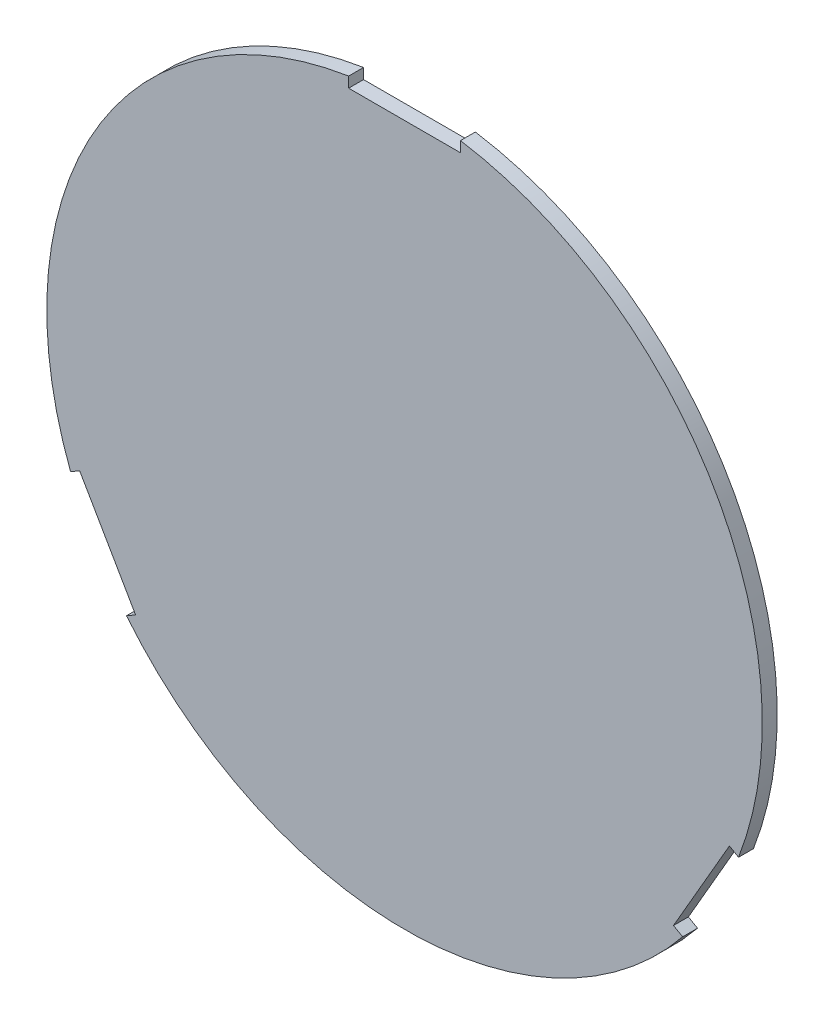
ISO-10303-21;
HEADER;
FILE_DESCRIPTION(('STEP AP214'),'2;1');
FILE_NAME('part.step','',(''),(''),'','','');
FILE_SCHEMA(('AUTOMOTIVE_DESIGN { 1 0 10303 214 1 1 1 1 }'));
ENDSEC;
DATA;
#1=APPLICATION_CONTEXT('core data for automotive mechanical design processes');
#2=APPLICATION_PROTOCOL_DEFINITION('international standard','automotive_design',2000,#1);
#3=PRODUCT_CONTEXT('',#1,'mechanical');
#4=PRODUCT('Part','Part','',(#3));
#5=PRODUCT_RELATED_PRODUCT_CATEGORY('part','',(#4));
#6=PRODUCT_DEFINITION_FORMATION('','',#4);
#7=PRODUCT_DEFINITION_CONTEXT('part definition',#1,'design');
#8=PRODUCT_DEFINITION('design','',#6,#7);
#9=PRODUCT_DEFINITION_SHAPE('','',#8);
#10=(LENGTH_UNIT() NAMED_UNIT(*) SI_UNIT(.MILLI.,.METRE.));
#11=(NAMED_UNIT(*) PLANE_ANGLE_UNIT() SI_UNIT($,.RADIAN.));
#12=(NAMED_UNIT(*) SI_UNIT($,.STERADIAN.) SOLID_ANGLE_UNIT());
#13=UNCERTAINTY_MEASURE_WITH_UNIT(LENGTH_MEASURE(1.E-05),#10,'distance_accuracy_value','');
#14=(GEOMETRIC_REPRESENTATION_CONTEXT(3) GLOBAL_UNCERTAINTY_ASSIGNED_CONTEXT((#13)) GLOBAL_UNIT_ASSIGNED_CONTEXT((#10,
#11,#12)) REPRESENTATION_CONTEXT('',''));
#15=CARTESIAN_POINT('',(0.,0.,0.));
#16=DIRECTION('',(0.,0.,1.));
#17=DIRECTION('',(1.,0.,0.));
#18=AXIS2_PLACEMENT_3D('',#15,#16,#17);
#19=CARTESIAN_POINT('',(0.,0.,2.));
#20=DIRECTION('',(0.,0.,-1.));
#21=DIRECTION('',(-1.,0.,0.));
#22=AXIS2_PLACEMENT_3D('',#19,#20,#21);
#23=CYLINDRICAL_SURFACE('',#22,48.);
#24=DIRECTION('',(0.,0.,-1.));
#25=VECTOR('',#24,1.);
#26=CARTESIAN_POINT('',(44.8086470795142,-17.2100304155323,2.));
#27=LINE('',#26,#25);
#28=CARTESIAN_POINT('',(44.8086470795142,-17.2100304155323,2.));
#29=VERTEX_POINT('',#28);
#30=CARTESIAN_POINT('',(44.8086470795142,-17.2100304155323,0.));
#31=VERTEX_POINT('',#30);
#32=EDGE_CURVE('E192',#29,#31,#27,.T.);
#33=ORIENTED_EDGE('',*,*,#32,.T.);
#34=CARTESIAN_POINT('',(0.,0.,0.));
#35=DIRECTION('',(0.,0.,1.));
#36=DIRECTION('',(1.,0.,0.));
#37=AXIS2_PLACEMENT_3D('',#34,#35,#36);
#38=CIRCLE('',#37,48.);
#39=CARTESIAN_POINT('',(7.5,47.4104418878373,0.));
#40=VERTEX_POINT('',#39);
#41=EDGE_CURVE('E202',#31,#40,#38,.T.);
#42=ORIENTED_EDGE('',*,*,#41,.T.);
#43=DIRECTION('',(0.,0.,-1.));
#44=VECTOR('',#43,1.);
#45=CARTESIAN_POINT('',(7.5,47.4104418878373,2.));
#46=LINE('',#45,#44);
#47=CARTESIAN_POINT('',(7.5,47.4104418878373,2.));
#48=VERTEX_POINT('',#47);
#49=EDGE_CURVE('E199',#48,#40,#46,.T.);
#50=ORIENTED_EDGE('',*,*,#49,.F.);
#51=CARTESIAN_POINT('',(0.,0.,2.));
#52=DIRECTION('',(0.,0.,1.));
#53=DIRECTION('',(1.,0.,0.));
#54=AXIS2_PLACEMENT_3D('',#51,#52,#53);
#55=CIRCLE('',#54,48.);
#56=EDGE_CURVE('E93',#29,#48,#55,.T.);
#57=ORIENTED_EDGE('',*,*,#56,.F.);
#58=EDGE_LOOP('',(#33,#42,#50,#57));
#59=FACE_BOUND('',#58,.T.);
#60=ADVANCED_FACE('F83',(#59),#23,.T.);
#61=CARTESIAN_POINT('',(-37.3086470795113,-30.2004114723041,0.));
#62=VERTEX_POINT('',#61);
#63=CARTESIAN_POINT('',(37.308647079515,-30.2004114722994,0.));
#64=VERTEX_POINT('',#63);
#65=EDGE_CURVE('E191',#62,#64,#38,.T.);
#66=ORIENTED_EDGE('',*,*,#65,.T.);
#67=DIRECTION('',(0.,0.,-1.));
#68=VECTOR('',#67,1.);
#69=CARTESIAN_POINT('',(37.308647079515,-30.2004114722994,2.));
#70=LINE('',#69,#68);
#71=CARTESIAN_POINT('',(37.308647079515,-30.2004114722994,2.));
#72=VERTEX_POINT('',#71);
#73=EDGE_CURVE('E177',#72,#64,#70,.T.);
#74=ORIENTED_EDGE('',*,*,#73,.F.);
#75=CARTESIAN_POINT('',(-37.3086470795113,-30.2004114723041,2.));
#76=VERTEX_POINT('',#75);
#77=EDGE_CURVE('E92',#76,#72,#55,.T.);
#78=ORIENTED_EDGE('',*,*,#77,.F.);
#79=DIRECTION('',(0.,0.,-1.));
#80=VECTOR('',#79,1.);
#81=CARTESIAN_POINT('',(-37.3086470795113,-30.2004114723041,2.));
#82=LINE('',#81,#80);
#83=EDGE_CURVE('E228',#76,#62,#82,.T.);
#84=ORIENTED_EDGE('',*,*,#83,.T.);
#85=EDGE_LOOP('',(#66,#74,#78,#84));
#86=FACE_BOUND('',#85,.T.);
#87=ADVANCED_FACE('F188',(#86),#23,.T.);
#88=CARTESIAN_POINT('',(-7.5,47.4104418878373,0.));
#89=VERTEX_POINT('',#88);
#90=CARTESIAN_POINT('',(-44.808647079512,-17.2100304155379,0.));
#91=VERTEX_POINT('',#90);
#92=EDGE_CURVE('E87',#89,#91,#38,.T.);
#93=ORIENTED_EDGE('',*,*,#92,.T.);
#94=DIRECTION('',(0.,0.,-1.));
#95=VECTOR('',#94,1.);
#96=CARTESIAN_POINT('',(-44.808647079512,-17.2100304155379,2.));
#97=LINE('',#96,#95);
#98=CARTESIAN_POINT('',(-44.808647079512,-17.2100304155379,2.));
#99=VERTEX_POINT('',#98);
#100=EDGE_CURVE('E221',#99,#91,#97,.T.);
#101=ORIENTED_EDGE('',*,*,#100,.F.);
#102=CARTESIAN_POINT('',(-7.5,47.4104418878373,2.));
#103=VERTEX_POINT('',#102);
#104=EDGE_CURVE('E12',#103,#99,#55,.T.);
#105=ORIENTED_EDGE('',*,*,#104,.F.);
#106=DIRECTION('',(0.,0.,-1.));
#107=VECTOR('',#106,1.);
#108=CARTESIAN_POINT('',(-7.5,47.4104418878373,2.));
#109=LINE('',#108,#107);
#110=EDGE_CURVE('E203',#103,#89,#109,.T.);
#111=ORIENTED_EDGE('',*,*,#110,.T.);
#112=EDGE_LOOP('',(#93,#101,#105,#111));
#113=FACE_BOUND('',#112,.T.);
#114=ADVANCED_FACE('F85',(#113),#23,.T.);
#115=CARTESIAN_POINT('',(0.,0.,2.));
#116=DIRECTION('',(0.,0.,1.));
#117=DIRECTION('',(1.,0.,0.));
#118=AXIS2_PLACEMENT_3D('',#115,#116,#117);
#119=PLANE('',#118);
#120=DIRECTION('',(-0.866025403784439,0.499999999999999,0.));
#121=VECTOR('',#120,1.);
#122=CARTESIAN_POINT('',(-3.74999999999841,-6.49519052838055,2.));
#123=LINE('',#122,#121);
#124=CARTESIAN_POINT('',(36.0871685740869,-29.4951905283811,2.));
#125=VERTEX_POINT('',#124);
#126=EDGE_CURVE('E174',#72,#125,#123,.T.);
#127=ORIENTED_EDGE('',*,*,#126,.T.);
#128=DIRECTION('',(-0.5,-0.866025403784439,0.));
#129=VECTOR('',#128,1.);
#130=CARTESIAN_POINT('',(39.8371685740853,-23.0000000000006,2.));
#131=LINE('',#130,#129);
#132=CARTESIAN_POINT('',(43.5871685740868,-16.5048094716146,2.));
#133=VERTEX_POINT('',#132);
#134=EDGE_CURVE('E252',#133,#125,#131,.T.);
#135=ORIENTED_EDGE('',*,*,#134,.F.);
#136=DIRECTION('',(-0.866025403784439,0.5,0.));
#137=VECTOR('',#136,1.);
#138=CARTESIAN_POINT('',(3.7500000000016,6.49519052838606,2.));
#139=LINE('',#138,#137);
#140=EDGE_CURVE('E182',#29,#133,#139,.T.);
#141=ORIENTED_EDGE('',*,*,#140,.F.);
#142=ORIENTED_EDGE('',*,*,#56,.T.);
#143=DIRECTION('',(0.,-1.,0.));
#144=VECTOR('',#143,1.);
#145=CARTESIAN_POINT('',(7.5,0.,2.));
#146=LINE('',#145,#144);
#147=CARTESIAN_POINT('',(7.5,46.,2.));
#148=VERTEX_POINT('',#147);
#149=EDGE_CURVE('E215',#48,#148,#146,.T.);
#150=ORIENTED_EDGE('',*,*,#149,.T.);
#151=DIRECTION('',(1.,0.,0.));
#152=VECTOR('',#151,1.);
#153=CARTESIAN_POINT('',(0.,46.,2.));
#154=LINE('',#153,#152);
#155=CARTESIAN_POINT('',(-7.5,46.,2.));
#156=VERTEX_POINT('',#155);
#157=EDGE_CURVE('E211',#156,#148,#154,.T.);
#158=ORIENTED_EDGE('',*,*,#157,.F.);
#159=DIRECTION('',(0.,-1.,0.));
#160=VECTOR('',#159,1.);
#161=CARTESIAN_POINT('',(-7.5,0.,2.));
#162=LINE('',#161,#160);
#163=EDGE_CURVE('E223',#103,#156,#162,.T.);
#164=ORIENTED_EDGE('',*,*,#163,.F.);
#165=ORIENTED_EDGE('',*,*,#104,.T.);
#166=DIRECTION('',(0.866025403784439,0.5,0.));
#167=VECTOR('',#166,1.);
#168=CARTESIAN_POINT('',(-3.74999999999866,6.49519052838097,2.));
#169=LINE('',#168,#167);
#170=CARTESIAN_POINT('',(-43.587168574081,-16.504809471618,2.));
#171=VERTEX_POINT('',#170);
#172=EDGE_CURVE('E238',#99,#171,#169,.T.);
#173=ORIENTED_EDGE('',*,*,#172,.T.);
#174=DIRECTION('',(-0.5,0.866025403784438,0.));
#175=VECTOR('',#174,1.);
#176=CARTESIAN_POINT('',(-39.8371685740823,-22.9999999999989,2.));
#177=LINE('',#176,#175);
#178=CARTESIAN_POINT('',(-36.087168574081,-29.4951905283845,2.));
#179=VERTEX_POINT('',#178);
#180=EDGE_CURVE('E234',#179,#171,#177,.T.);
#181=ORIENTED_EDGE('',*,*,#180,.F.);
#182=DIRECTION('',(0.866025403784438,0.500000000000001,0.));
#183=VECTOR('',#182,1.);
#184=CARTESIAN_POINT('',(3.75000000000133,-6.49519052838558,2.));
#185=LINE('',#184,#183);
#186=EDGE_CURVE('E197',#76,#179,#185,.T.);
#187=ORIENTED_EDGE('',*,*,#186,.F.);
#188=ORIENTED_EDGE('',*,*,#77,.T.);
#189=EDGE_LOOP('',(#127,#135,#141,#142,#150,#158,#164,#165,#173,#181,#187,#188));
#190=FACE_BOUND('',#189,.T.);
#191=ADVANCED_FACE('F195',(#190),#119,.T.);
#192=CARTESIAN_POINT('',(0.,0.,0.));
#193=DIRECTION('',(0.,0.,1.));
#194=DIRECTION('',(1.,0.,0.));
#195=AXIS2_PLACEMENT_3D('',#192,#193,#194);
#196=PLANE('',#195);
#197=DIRECTION('',(-0.5,-0.866025403784439,0.));
#198=VECTOR('',#197,1.);
#199=CARTESIAN_POINT('',(39.8371685740853,-23.0000000000006,0.));
#200=LINE('',#199,#198);
#201=CARTESIAN_POINT('',(43.5871685740868,-16.5048094716146,0.));
#202=VERTEX_POINT('',#201);
#203=CARTESIAN_POINT('',(36.0871685740869,-29.4951905283811,0.));
#204=VERTEX_POINT('',#203);
#205=EDGE_CURVE('E183',#202,#204,#200,.T.);
#206=ORIENTED_EDGE('',*,*,#205,.T.);
#207=DIRECTION('',(-0.866025403784439,0.499999999999999,0.));
#208=VECTOR('',#207,1.);
#209=CARTESIAN_POINT('',(-3.74999999999841,-6.49519052838055,0.));
#210=LINE('',#209,#208);
#211=EDGE_CURVE('E100',#64,#204,#210,.T.);
#212=ORIENTED_EDGE('',*,*,#211,.F.);
#213=ORIENTED_EDGE('',*,*,#65,.F.);
#214=DIRECTION('',(0.866025403784438,0.500000000000001,0.));
#215=VECTOR('',#214,1.);
#216=CARTESIAN_POINT('',(3.75000000000133,-6.49519052838558,0.));
#217=LINE('',#216,#215);
#218=CARTESIAN_POINT('',(-36.087168574081,-29.4951905283845,0.));
#219=VERTEX_POINT('',#218);
#220=EDGE_CURVE('E239',#62,#219,#217,.T.);
#221=ORIENTED_EDGE('',*,*,#220,.T.);
#222=DIRECTION('',(-0.5,0.866025403784438,0.));
#223=VECTOR('',#222,1.);
#224=CARTESIAN_POINT('',(-39.8371685740823,-22.9999999999989,0.));
#225=LINE('',#224,#223);
#226=CARTESIAN_POINT('',(-43.587168574081,-16.504809471618,0.));
#227=VERTEX_POINT('',#226);
#228=EDGE_CURVE('E235',#219,#227,#225,.T.);
#229=ORIENTED_EDGE('',*,*,#228,.T.);
#230=DIRECTION('',(0.866025403784439,0.5,0.));
#231=VECTOR('',#230,1.);
#232=CARTESIAN_POINT('',(-3.74999999999866,6.49519052838097,0.));
#233=LINE('',#232,#231);
#234=EDGE_CURVE('E108',#91,#227,#233,.T.);
#235=ORIENTED_EDGE('',*,*,#234,.F.);
#236=ORIENTED_EDGE('',*,*,#92,.F.);
#237=DIRECTION('',(0.,-1.,0.));
#238=VECTOR('',#237,1.);
#239=CARTESIAN_POINT('',(-7.5,0.,0.));
#240=LINE('',#239,#238);
#241=CARTESIAN_POINT('',(-7.5,46.,0.));
#242=VERTEX_POINT('',#241);
#243=EDGE_CURVE('E216',#89,#242,#240,.T.);
#244=ORIENTED_EDGE('',*,*,#243,.T.);
#245=DIRECTION('',(1.,0.,0.));
#246=VECTOR('',#245,1.);
#247=CARTESIAN_POINT('',(0.,46.,0.));
#248=LINE('',#247,#246);
#249=CARTESIAN_POINT('',(7.5,46.,0.));
#250=VERTEX_POINT('',#249);
#251=EDGE_CURVE('E212',#242,#250,#248,.T.);
#252=ORIENTED_EDGE('',*,*,#251,.T.);
#253=DIRECTION('',(0.,-1.,0.));
#254=VECTOR('',#253,1.);
#255=CARTESIAN_POINT('',(7.5,0.,0.));
#256=LINE('',#255,#254);
#257=EDGE_CURVE('E219',#40,#250,#256,.T.);
#258=ORIENTED_EDGE('',*,*,#257,.F.);
#259=ORIENTED_EDGE('',*,*,#41,.F.);
#260=DIRECTION('',(-0.866025403784439,0.5,0.));
#261=VECTOR('',#260,1.);
#262=CARTESIAN_POINT('',(3.7500000000016,6.49519052838606,0.));
#263=LINE('',#262,#261);
#264=EDGE_CURVE('E255',#31,#202,#263,.T.);
#265=ORIENTED_EDGE('',*,*,#264,.T.);
#266=EDGE_LOOP('',(#206,#212,#213,#221,#229,#235,#236,#244,#252,#258,#259,#265));
#267=FACE_BOUND('',#266,.T.);
#268=ADVANCED_FACE('F270',(#267),#196,.F.);
#269=CARTESIAN_POINT('',(7.5,0.,2.));
#270=DIRECTION('',(1.,0.,0.));
#271=DIRECTION('',(0.,0.,-1.));
#272=AXIS2_PLACEMENT_3D('',#269,#270,#271);
#273=PLANE('',#272);
#274=ORIENTED_EDGE('',*,*,#257,.T.);
#275=DIRECTION('',(0.,0.,-1.));
#276=VECTOR('',#275,1.);
#277=CARTESIAN_POINT('',(7.5,46.,2.));
#278=LINE('',#277,#276);
#279=EDGE_CURVE('E208',#148,#250,#278,.T.);
#280=ORIENTED_EDGE('',*,*,#279,.F.);
#281=ORIENTED_EDGE('',*,*,#149,.F.);
#282=ORIENTED_EDGE('',*,*,#49,.T.);
#283=EDGE_LOOP('',(#274,#280,#281,#282));
#284=FACE_BOUND('',#283,.T.);
#285=ADVANCED_FACE('F278',(#284),#273,.F.);
#286=CARTESIAN_POINT('',(-7.5,0.,2.));
#287=DIRECTION('',(1.,0.,0.));
#288=DIRECTION('',(0.,0.,-1.));
#289=AXIS2_PLACEMENT_3D('',#286,#287,#288);
#290=PLANE('',#289);
#291=ORIENTED_EDGE('',*,*,#243,.F.);
#292=ORIENTED_EDGE('',*,*,#110,.F.);
#293=ORIENTED_EDGE('',*,*,#163,.T.);
#294=DIRECTION('',(0.,0.,-1.));
#295=VECTOR('',#294,1.);
#296=CARTESIAN_POINT('',(-7.5,46.,2.));
#297=LINE('',#296,#295);
#298=EDGE_CURVE('E206',#156,#242,#297,.T.);
#299=ORIENTED_EDGE('',*,*,#298,.T.);
#300=EDGE_LOOP('',(#291,#292,#293,#299));
#301=FACE_BOUND('',#300,.T.);
#302=ADVANCED_FACE('F286',(#301),#290,.T.);
#303=CARTESIAN_POINT('',(0.,46.,2.));
#304=DIRECTION('',(0.,1.,0.));
#305=DIRECTION('',(0.,0.,1.));
#306=AXIS2_PLACEMENT_3D('',#303,#304,#305);
#307=PLANE('',#306);
#308=ORIENTED_EDGE('',*,*,#251,.F.);
#309=ORIENTED_EDGE('',*,*,#298,.F.);
#310=ORIENTED_EDGE('',*,*,#157,.T.);
#311=ORIENTED_EDGE('',*,*,#279,.T.);
#312=EDGE_LOOP('',(#308,#309,#310,#311));
#313=FACE_BOUND('',#312,.T.);
#314=ADVANCED_FACE('F281',(#313),#307,.T.);
#315=CARTESIAN_POINT('',(-3.74999999999866,6.49519052838097,2.));
#316=DIRECTION('',(-0.5,0.866025403784439,0.));
#317=DIRECTION('',(-0.866025403784439,-0.5,0.));
#318=AXIS2_PLACEMENT_3D('',#315,#316,#317);
#319=PLANE('',#318);
#320=ORIENTED_EDGE('',*,*,#234,.T.);
#321=DIRECTION('',(0.,0.,-1.));
#322=VECTOR('',#321,1.);
#323=CARTESIAN_POINT('',(-43.587168574081,-16.504809471618,2.));
#324=LINE('',#323,#322);
#325=EDGE_CURVE('E232',#171,#227,#324,.T.);
#326=ORIENTED_EDGE('',*,*,#325,.F.);
#327=ORIENTED_EDGE('',*,*,#172,.F.);
#328=ORIENTED_EDGE('',*,*,#100,.T.);
#329=EDGE_LOOP('',(#320,#326,#327,#328));
#330=FACE_BOUND('',#329,.T.);
#331=ADVANCED_FACE('F291',(#330),#319,.F.);
#332=CARTESIAN_POINT('',(3.75000000000133,-6.49519052838558,2.));
#333=DIRECTION('',(-0.500000000000001,0.866025403784438,0.));
#334=DIRECTION('',(-0.866025403784438,-0.500000000000001,0.));
#335=AXIS2_PLACEMENT_3D('',#332,#333,#334);
#336=PLANE('',#335);
#337=ORIENTED_EDGE('',*,*,#220,.F.);
#338=ORIENTED_EDGE('',*,*,#83,.F.);
#339=ORIENTED_EDGE('',*,*,#186,.T.);
#340=DIRECTION('',(0.,0.,-1.));
#341=VECTOR('',#340,1.);
#342=CARTESIAN_POINT('',(-36.087168574081,-29.4951905283845,2.));
#343=LINE('',#342,#341);
#344=EDGE_CURVE('E230',#179,#219,#343,.T.);
#345=ORIENTED_EDGE('',*,*,#344,.T.);
#346=EDGE_LOOP('',(#337,#338,#339,#345));
#347=FACE_BOUND('',#346,.T.);
#348=ADVANCED_FACE('F297',(#347),#336,.T.);
#349=CARTESIAN_POINT('',(-39.8371685740823,-22.9999999999989,2.));
#350=DIRECTION('',(-0.866025403784438,-0.5,0.));
#351=DIRECTION('',(0.5,-0.866025403784438,0.));
#352=AXIS2_PLACEMENT_3D('',#349,#350,#351);
#353=PLANE('',#352);
#354=ORIENTED_EDGE('',*,*,#228,.F.);
#355=ORIENTED_EDGE('',*,*,#344,.F.);
#356=ORIENTED_EDGE('',*,*,#180,.T.);
#357=ORIENTED_EDGE('',*,*,#325,.T.);
#358=EDGE_LOOP('',(#354,#355,#356,#357));
#359=FACE_BOUND('',#358,.T.);
#360=ADVANCED_FACE('F294',(#359),#353,.T.);
#361=CARTESIAN_POINT('',(-3.74999999999841,-6.49519052838055,2.));
#362=DIRECTION('',(-0.499999999999999,-0.866025403784439,0.));
#363=DIRECTION('',(0.866025403784439,-0.499999999999999,0.));
#364=AXIS2_PLACEMENT_3D('',#361,#362,#363);
#365=PLANE('',#364);
#366=ORIENTED_EDGE('',*,*,#211,.T.);
#367=DIRECTION('',(0.,0.,-1.));
#368=VECTOR('',#367,1.);
#369=CARTESIAN_POINT('',(36.0871685740869,-29.4951905283811,2.));
#370=LINE('',#369,#368);
#371=EDGE_CURVE('E178',#125,#204,#370,.T.);
#372=ORIENTED_EDGE('',*,*,#371,.F.);
#373=ORIENTED_EDGE('',*,*,#126,.F.);
#374=ORIENTED_EDGE('',*,*,#73,.T.);
#375=EDGE_LOOP('',(#366,#372,#373,#374));
#376=FACE_BOUND('',#375,.T.);
#377=ADVANCED_FACE('F176',(#376),#365,.F.);
#378=CARTESIAN_POINT('',(3.7500000000016,6.49519052838606,2.));
#379=DIRECTION('',(-0.5,-0.866025403784439,0.));
#380=DIRECTION('',(0.866025403784439,-0.5,0.));
#381=AXIS2_PLACEMENT_3D('',#378,#379,#380);
#382=PLANE('',#381);
#383=ORIENTED_EDGE('',*,*,#264,.F.);
#384=ORIENTED_EDGE('',*,*,#32,.F.);
#385=ORIENTED_EDGE('',*,*,#140,.T.);
#386=DIRECTION('',(0.,0.,-1.));
#387=VECTOR('',#386,1.);
#388=CARTESIAN_POINT('',(43.5871685740868,-16.5048094716146,2.));
#389=LINE('',#388,#387);
#390=EDGE_CURVE('E249',#133,#202,#389,.T.);
#391=ORIENTED_EDGE('',*,*,#390,.T.);
#392=EDGE_LOOP('',(#383,#384,#385,#391));
#393=FACE_BOUND('',#392,.T.);
#394=ADVANCED_FACE('F263',(#393),#382,.T.);
#395=CARTESIAN_POINT('',(39.8371685740853,-23.0000000000006,2.));
#396=DIRECTION('',(0.866025403784439,-0.5,0.));
#397=DIRECTION('',(0.5,0.866025403784439,0.));
#398=AXIS2_PLACEMENT_3D('',#395,#396,#397);
#399=PLANE('',#398);
#400=ORIENTED_EDGE('',*,*,#205,.F.);
#401=ORIENTED_EDGE('',*,*,#390,.F.);
#402=ORIENTED_EDGE('',*,*,#134,.T.);
#403=ORIENTED_EDGE('',*,*,#371,.T.);
#404=EDGE_LOOP('',(#400,#401,#402,#403));
#405=FACE_BOUND('',#404,.T.);
#406=ADVANCED_FACE('F267',(#405),#399,.T.);
#407=CLOSED_SHELL('',(#60,#87,#114,#191,#268,#285,#302,#314,#331,#348,#360,#377,#394,#406));
#408=MANIFOLD_SOLID_BREP('B2',#407);
#409=ADVANCED_BREP_SHAPE_REPRESENTATION('',(#18,#408),#14);
#410=SHAPE_DEFINITION_REPRESENTATION(#9,#409);
ENDSEC;
END-ISO-10303-21;
